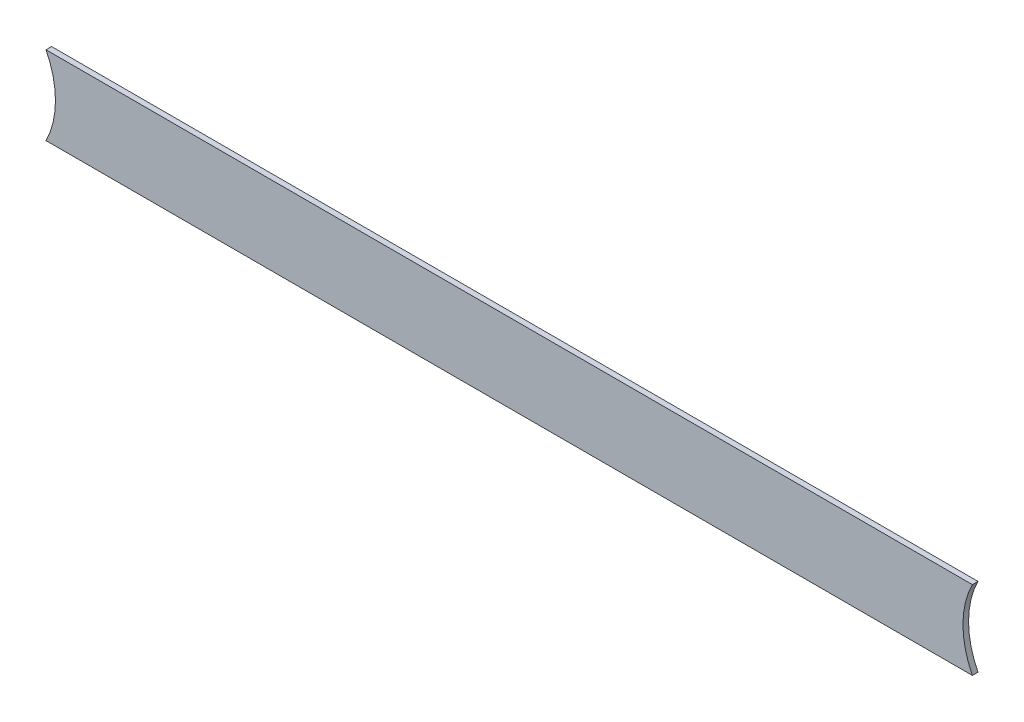
ISO-10303-21;
HEADER;
FILE_DESCRIPTION(('STEP AP214'),'2;1');
FILE_NAME('part.step','',(''),(''),'','','');
FILE_SCHEMA(('AUTOMOTIVE_DESIGN { 1 0 10303 214 1 1 1 1 }'));
ENDSEC;
DATA;
#1=APPLICATION_CONTEXT('core data for automotive mechanical design processes');
#2=APPLICATION_PROTOCOL_DEFINITION('international standard','automotive_design',2000,#1);
#3=PRODUCT_CONTEXT('',#1,'mechanical');
#4=PRODUCT('Part','Part','',(#3));
#5=PRODUCT_RELATED_PRODUCT_CATEGORY('part','',(#4));
#6=PRODUCT_DEFINITION_FORMATION('','',#4);
#7=PRODUCT_DEFINITION_CONTEXT('part definition',#1,'design');
#8=PRODUCT_DEFINITION('design','',#6,#7);
#9=PRODUCT_DEFINITION_SHAPE('','',#8);
#10=(LENGTH_UNIT() NAMED_UNIT(*) SI_UNIT(.MILLI.,.METRE.));
#11=(NAMED_UNIT(*) PLANE_ANGLE_UNIT() SI_UNIT($,.RADIAN.));
#12=(NAMED_UNIT(*) SI_UNIT($,.STERADIAN.) SOLID_ANGLE_UNIT());
#13=UNCERTAINTY_MEASURE_WITH_UNIT(LENGTH_MEASURE(1.E-05),#10,'distance_accuracy_value','');
#14=(GEOMETRIC_REPRESENTATION_CONTEXT(3) GLOBAL_UNCERTAINTY_ASSIGNED_CONTEXT((#13)) GLOBAL_UNIT_ASSIGNED_CONTEXT((#10,
#11,#12)) REPRESENTATION_CONTEXT('',''));
#15=CARTESIAN_POINT('',(0.,0.,0.));
#16=DIRECTION('',(0.,0.,1.));
#17=DIRECTION('',(1.,0.,0.));
#18=AXIS2_PLACEMENT_3D('',#15,#16,#17);
#19=CARTESIAN_POINT('',(79.3899169687607,52.6432653,0.));
#20=DIRECTION('',(0.,1.,0.));
#21=DIRECTION('',(1.,0.,0.));
#22=AXIS2_PLACEMENT_3D('',#19,#20,#21);
#23=PLANE('',#22);
#24=DIRECTION('',(1.,0.,0.));
#25=VECTOR('',#24,1.);
#26=CARTESIAN_POINT('',(78.90002,52.6432653,0.03556));
#27=LINE('',#26,#25);
#28=CARTESIAN_POINT('',(79.3899169687607,52.6432653,0.03556));
#29=VERTEX_POINT('',#28);
#30=CARTESIAN_POINT('',(85.2775210312393,52.6432653,0.03556));
#31=VERTEX_POINT('',#30);
#32=EDGE_CURVE('E11',#29,#31,#27,.T.);
#33=ORIENTED_EDGE('',*,*,#32,.F.);
#34=DIRECTION('',(0.,0.,1.));
#35=VECTOR('',#34,1.);
#36=CARTESIAN_POINT('',(79.3899169687607,52.6432653,0.));
#37=LINE('',#36,#35);
#38=CARTESIAN_POINT('',(79.3899169687607,52.6432653,0.));
#39=VERTEX_POINT('',#38);
#40=EDGE_CURVE('E24',#39,#29,#37,.T.);
#41=ORIENTED_EDGE('',*,*,#40,.F.);
#42=DIRECTION('',(1.,0.,0.));
#43=VECTOR('',#42,1.);
#44=CARTESIAN_POINT('',(78.90002,52.6432653,0.));
#45=LINE('',#44,#43);
#46=CARTESIAN_POINT('',(85.2775210312393,52.6432653,0.));
#47=VERTEX_POINT('',#46);
#48=EDGE_CURVE('E82',#39,#47,#45,.T.);
#49=ORIENTED_EDGE('',*,*,#48,.T.);
#50=DIRECTION('',(0.,0.,1.));
#51=VECTOR('',#50,1.);
#52=CARTESIAN_POINT('',(85.2775210312393,52.6432653,0.));
#53=LINE('',#52,#51);
#54=EDGE_CURVE('E37',#47,#31,#53,.T.);
#55=ORIENTED_EDGE('',*,*,#54,.T.);
#56=EDGE_LOOP('',(#33,#41,#49,#55));
#57=FACE_BOUND('',#56,.T.);
#58=ADVANCED_FACE('F17',(#57),#23,.F.);
#59=CARTESIAN_POINT('',(85.767418,52.8932648,0.));
#60=DIRECTION('',(0.,0.,-1.));
#61=DIRECTION('',(1.,0.,0.));
#62=AXIS2_PLACEMENT_3D('',#59,#60,#61);
#63=CYLINDRICAL_SURFACE('',#62,0.5499989);
#64=DIRECTION('',(0.,0.,1.));
#65=VECTOR('',#64,1.);
#66=CARTESIAN_POINT('',(85.2775210312393,53.1432643,0.));
#67=LINE('',#66,#65);
#68=CARTESIAN_POINT('',(85.2775210312393,53.1432643,0.));
#69=VERTEX_POINT('',#68);
#70=CARTESIAN_POINT('',(85.2775210312393,53.1432643,0.03556));
#71=VERTEX_POINT('',#70);
#72=EDGE_CURVE('E97',#69,#71,#67,.T.);
#73=ORIENTED_EDGE('',*,*,#72,.T.);
#74=CARTESIAN_POINT('',(85.767418,52.8932648,0.03556));
#75=DIRECTION('',(0.,0.,1.));
#76=DIRECTION('',(1.,0.,0.));
#77=AXIS2_PLACEMENT_3D('',#74,#75,#76);
#78=CIRCLE('',#77,0.5499989);
#79=EDGE_CURVE('E94',#71,#31,#78,.T.);
#80=ORIENTED_EDGE('',*,*,#79,.T.);
#81=ORIENTED_EDGE('',*,*,#54,.F.);
#82=CARTESIAN_POINT('',(85.767418,52.8932648,0.));
#83=DIRECTION('',(0.,0.,1.));
#84=DIRECTION('',(1.,0.,0.));
#85=AXIS2_PLACEMENT_3D('',#82,#83,#84);
#86=CIRCLE('',#85,0.5499989);
#87=EDGE_CURVE('E92',#69,#47,#86,.T.);
#88=ORIENTED_EDGE('',*,*,#87,.F.);
#89=EDGE_LOOP('',(#73,#80,#81,#88));
#90=FACE_BOUND('',#89,.T.);
#91=ADVANCED_FACE('F102',(#90),#63,.F.);
#92=CARTESIAN_POINT('',(85.2775210312393,53.1432643,0.));
#93=DIRECTION('',(0.,-1.,0.));
#94=DIRECTION('',(-1.,0.,0.));
#95=AXIS2_PLACEMENT_3D('',#92,#93,#94);
#96=PLANE('',#95);
#97=DIRECTION('',(-1.,0.,0.));
#98=VECTOR('',#97,1.);
#99=CARTESIAN_POINT('',(85.767418,53.1432643,0.03556));
#100=LINE('',#99,#98);
#101=CARTESIAN_POINT('',(79.3899169687607,53.1432643,0.03556));
#102=VERTEX_POINT('',#101);
#103=EDGE_CURVE('E89',#71,#102,#100,.T.);
#104=ORIENTED_EDGE('',*,*,#103,.F.);
#105=ORIENTED_EDGE('',*,*,#72,.F.);
#106=DIRECTION('',(-1.,0.,0.));
#107=VECTOR('',#106,1.);
#108=CARTESIAN_POINT('',(85.767418,53.1432643,0.));
#109=LINE('',#108,#107);
#110=CARTESIAN_POINT('',(79.3899169687607,53.1432643,0.));
#111=VERTEX_POINT('',#110);
#112=EDGE_CURVE('E87',#69,#111,#109,.T.);
#113=ORIENTED_EDGE('',*,*,#112,.T.);
#114=DIRECTION('',(0.,0.,1.));
#115=VECTOR('',#114,1.);
#116=CARTESIAN_POINT('',(79.3899169687607,53.1432643,0.));
#117=LINE('',#116,#115);
#118=EDGE_CURVE('E69',#111,#102,#117,.T.);
#119=ORIENTED_EDGE('',*,*,#118,.T.);
#120=EDGE_LOOP('',(#104,#105,#113,#119));
#121=FACE_BOUND('',#120,.T.);
#122=ADVANCED_FACE('F108',(#121),#96,.F.);
#123=CARTESIAN_POINT('',(78.90002,52.8932648,0.));
#124=DIRECTION('',(0.,0.,-1.));
#125=DIRECTION('',(1.,0.,0.));
#126=AXIS2_PLACEMENT_3D('',#123,#124,#125);
#127=CYLINDRICAL_SURFACE('',#126,0.5499989);
#128=DIRECTION('',(0.,0.,1.));
#129=VECTOR('',#128,1.);
#130=CARTESIAN_POINT('',(79.4500189,52.8932648,0.));
#131=LINE('',#130,#129);
#132=CARTESIAN_POINT('',(79.4500189,52.8932648,0.));
#133=VERTEX_POINT('',#132);
#134=CARTESIAN_POINT('',(79.4500189,52.8932648,0.03556));
#135=VERTEX_POINT('',#134);
#136=EDGE_CURVE('E59',#133,#135,#131,.T.);
#137=ORIENTED_EDGE('',*,*,#136,.T.);
#138=CARTESIAN_POINT('',(78.90002,52.8932648,0.03556));
#139=DIRECTION('',(0.,0.,1.));
#140=DIRECTION('',(1.,0.,0.));
#141=AXIS2_PLACEMENT_3D('',#138,#139,#140);
#142=CIRCLE('',#141,0.5499989);
#143=EDGE_CURVE('E70',#135,#102,#142,.T.);
#144=ORIENTED_EDGE('',*,*,#143,.T.);
#145=ORIENTED_EDGE('',*,*,#118,.F.);
#146=CARTESIAN_POINT('',(78.90002,52.8932648,0.));
#147=DIRECTION('',(0.,0.,1.));
#148=DIRECTION('',(1.,0.,0.));
#149=AXIS2_PLACEMENT_3D('',#146,#147,#148);
#150=CIRCLE('',#149,0.5499989);
#151=EDGE_CURVE('E73',#133,#111,#150,.T.);
#152=ORIENTED_EDGE('',*,*,#151,.F.);
#153=EDGE_LOOP('',(#137,#144,#145,#152));
#154=FACE_BOUND('',#153,.T.);
#155=ADVANCED_FACE('F74',(#154),#127,.F.);
#156=CARTESIAN_POINT('',(78.90002,52.8932648,0.));
#157=DIRECTION('',(0.,0.,-1.));
#158=DIRECTION('',(1.,0.,0.));
#159=AXIS2_PLACEMENT_3D('',#156,#157,#158);
#160=CYLINDRICAL_SURFACE('',#159,0.5499989);
#161=ORIENTED_EDGE('',*,*,#40,.T.);
#162=CARTESIAN_POINT('',(78.90002,52.8932648,0.03556));
#163=DIRECTION('',(0.,0.,1.));
#164=DIRECTION('',(1.,0.,0.));
#165=AXIS2_PLACEMENT_3D('',#162,#163,#164);
#166=CIRCLE('',#165,0.5499989);
#167=EDGE_CURVE('E65',#29,#135,#166,.T.);
#168=ORIENTED_EDGE('',*,*,#167,.T.);
#169=ORIENTED_EDGE('',*,*,#136,.F.);
#170=EDGE_CURVE('E63',#39,#133,#150,.T.);
#171=ORIENTED_EDGE('',*,*,#170,.F.);
#172=EDGE_LOOP('',(#161,#168,#169,#171));
#173=FACE_BOUND('',#172,.T.);
#174=ADVANCED_FACE('F61',(#173),#160,.F.);
#175=CARTESIAN_POINT('',(78.90002,52.6432653,0.));
#176=DIRECTION('',(0.,0.,-1.));
#177=DIRECTION('',(-1.,0.,0.));
#178=AXIS2_PLACEMENT_3D('',#175,#176,#177);
#179=PLANE('',#178);
#180=ORIENTED_EDGE('',*,*,#48,.F.);
#181=ORIENTED_EDGE('',*,*,#170,.T.);
#182=ORIENTED_EDGE('',*,*,#151,.T.);
#183=ORIENTED_EDGE('',*,*,#112,.F.);
#184=ORIENTED_EDGE('',*,*,#87,.T.);
#185=EDGE_LOOP('',(#180,#181,#182,#183,#184));
#186=FACE_BOUND('',#185,.T.);
#187=ADVANCED_FACE('F80',(#186),#179,.T.);
#188=CARTESIAN_POINT('',(78.90002,52.6432653,0.03556));
#189=DIRECTION('',(0.,0.,-1.));
#190=DIRECTION('',(-1.,0.,0.));
#191=AXIS2_PLACEMENT_3D('',#188,#189,#190);
#192=PLANE('',#191);
#193=ORIENTED_EDGE('',*,*,#167,.F.);
#194=ORIENTED_EDGE('',*,*,#32,.T.);
#195=ORIENTED_EDGE('',*,*,#79,.F.);
#196=ORIENTED_EDGE('',*,*,#103,.T.);
#197=ORIENTED_EDGE('',*,*,#143,.F.);
#198=EDGE_LOOP('',(#193,#194,#195,#196,#197));
#199=FACE_BOUND('',#198,.T.);
#200=ADVANCED_FACE('F106',(#199),#192,.F.);
#201=CLOSED_SHELL('',(#58,#91,#122,#155,#174,#187,#200));
#202=MANIFOLD_SOLID_BREP('B1',#201);
#203=ADVANCED_BREP_SHAPE_REPRESENTATION('',(#18,#202),#14);
#204=SHAPE_DEFINITION_REPRESENTATION(#9,#203);
ENDSEC;
END-ISO-10303-21;
